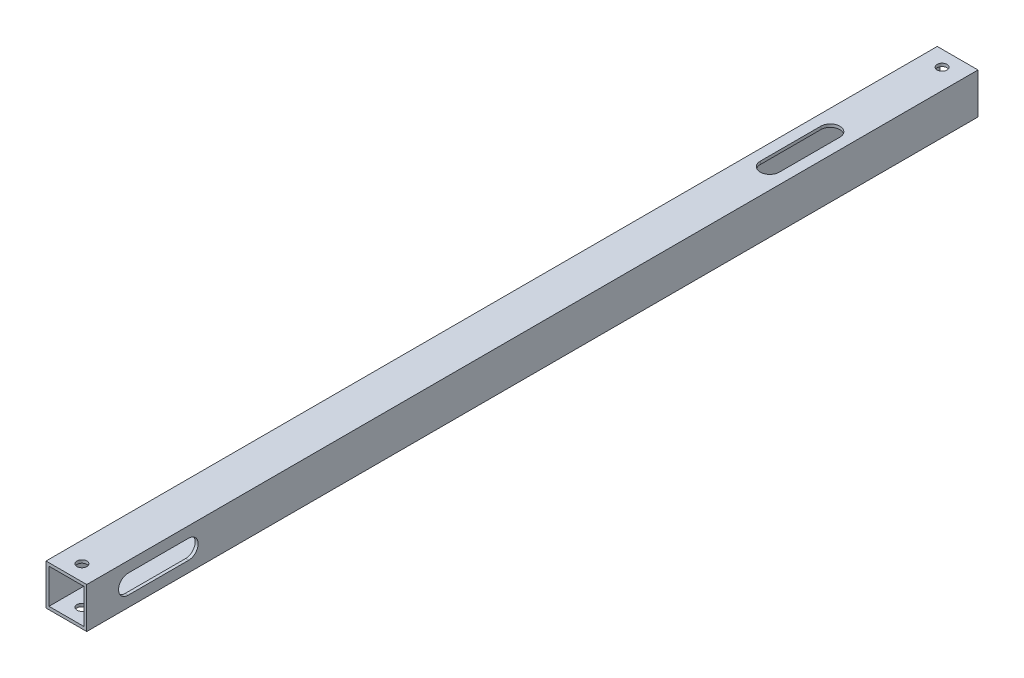
ISO-10303-21;
HEADER;
FILE_DESCRIPTION(('STEP AP214'),'2;1');
FILE_NAME('part.step','',(''),(''),'','','');
FILE_SCHEMA(('AUTOMOTIVE_DESIGN { 1 0 10303 214 1 1 1 1 }'));
ENDSEC;
DATA;
#1=APPLICATION_CONTEXT('core data for automotive mechanical design processes');
#2=APPLICATION_PROTOCOL_DEFINITION('international standard','automotive_design',2000,#1);
#3=PRODUCT_CONTEXT('',#1,'mechanical');
#4=PRODUCT('Part','Part','',(#3));
#5=PRODUCT_RELATED_PRODUCT_CATEGORY('part','',(#4));
#6=PRODUCT_DEFINITION_FORMATION('','',#4);
#7=PRODUCT_DEFINITION_CONTEXT('part definition',#1,'design');
#8=PRODUCT_DEFINITION('design','',#6,#7);
#9=PRODUCT_DEFINITION_SHAPE('','',#8);
#10=(LENGTH_UNIT() NAMED_UNIT(*) SI_UNIT(.MILLI.,.METRE.));
#11=(NAMED_UNIT(*) PLANE_ANGLE_UNIT() SI_UNIT($,.RADIAN.));
#12=(NAMED_UNIT(*) SI_UNIT($,.STERADIAN.) SOLID_ANGLE_UNIT());
#13=UNCERTAINTY_MEASURE_WITH_UNIT(LENGTH_MEASURE(1.E-05),#10,'distance_accuracy_value','');
#14=(GEOMETRIC_REPRESENTATION_CONTEXT(3) GLOBAL_UNCERTAINTY_ASSIGNED_CONTEXT((#13)) GLOBAL_UNIT_ASSIGNED_CONTEXT((#10,
#11,#12)) REPRESENTATION_CONTEXT('',''));
#15=CARTESIAN_POINT('',(0.,0.,0.));
#16=DIRECTION('',(0.,0.,1.));
#17=DIRECTION('',(1.,0.,0.));
#18=AXIS2_PLACEMENT_3D('',#15,#16,#17);
#19=CARTESIAN_POINT('',(-6.4,6.4,-280.));
#20=DIRECTION('',(0.,1.,0.));
#21=DIRECTION('',(-1.,0.,0.));
#22=AXIS2_PLACEMENT_3D('',#19,#20,#21);
#23=PLANE('',#22);
#24=DIRECTION('',(-1.,0.,0.));
#25=VECTOR('',#24,1.);
#26=CARTESIAN_POINT('',(-6.4,6.4,0.));
#27=LINE('',#26,#25);
#28=CARTESIAN_POINT('',(6.4,6.4,0.));
#29=VERTEX_POINT('',#28);
#30=CARTESIAN_POINT('',(-6.4,6.4,0.));
#31=VERTEX_POINT('',#30);
#32=EDGE_CURVE('E339',#29,#31,#27,.T.);
#33=ORIENTED_EDGE('',*,*,#32,.F.);
#34=DIRECTION('',(0.,0.,1.));
#35=VECTOR('',#34,1.);
#36=CARTESIAN_POINT('',(6.4,6.4,-280.));
#37=LINE('',#36,#35);
#38=CARTESIAN_POINT('',(6.4,6.4,-280.));
#39=VERTEX_POINT('',#38);
#40=EDGE_CURVE('E335',#39,#29,#37,.T.);
#41=ORIENTED_EDGE('',*,*,#40,.F.);
#42=DIRECTION('',(-1.,0.,0.));
#43=VECTOR('',#42,1.);
#44=CARTESIAN_POINT('',(-6.4,6.4,-280.));
#45=LINE('',#44,#43);
#46=CARTESIAN_POINT('',(-6.4,6.4,-280.));
#47=VERTEX_POINT('',#46);
#48=EDGE_CURVE('E322',#39,#47,#45,.T.);
#49=ORIENTED_EDGE('',*,*,#48,.T.);
#50=DIRECTION('',(0.,0.,1.));
#51=VECTOR('',#50,1.);
#52=CARTESIAN_POINT('',(-6.4,6.4,-280.));
#53=LINE('',#52,#51);
#54=EDGE_CURVE('E357',#47,#31,#53,.T.);
#55=ORIENTED_EDGE('',*,*,#54,.T.);
#56=EDGE_LOOP('',(#33,#41,#49,#55));
#57=FACE_BOUND('',#56,.T.);
#58=CARTESIAN_POINT('',(0.,6.4,-4.89));
#59=DIRECTION('',(0.,1.,0.));
#60=DIRECTION('',(-1.,0.,0.));
#61=AXIS2_PLACEMENT_3D('',#58,#59,#60);
#62=CIRCLE('',#61,1.55);
#63=CARTESIAN_POINT('',(-1.55,6.4,-4.89));
#64=VERTEX_POINT('',#63);
#65=EDGE_CURVE('E252',#64,#64,#62,.T.);
#66=ORIENTED_EDGE('',*,*,#65,.F.);
#67=EDGE_LOOP('',(#66));
#68=FACE_BOUND('',#67,.T.);
#69=CARTESIAN_POINT('',(0.,6.4,-275.11));
#70=DIRECTION('',(0.,1.,0.));
#71=DIRECTION('',(-1.,0.,0.));
#72=AXIS2_PLACEMENT_3D('',#69,#70,#71);
#73=CIRCLE('',#72,1.55000000000001);
#74=CARTESIAN_POINT('',(-1.55000000000001,6.4,-275.11));
#75=VERTEX_POINT('',#74);
#76=EDGE_CURVE('E265',#75,#75,#73,.F.);
#77=ORIENTED_EDGE('',*,*,#76,.T.);
#78=EDGE_LOOP('',(#77));
#79=FACE_BOUND('',#78,.T.);
#80=DIRECTION('',(0.,0.,-1.));
#81=VECTOR('',#80,1.);
#82=CARTESIAN_POINT('',(-2.99999999999996,6.4,-280.));
#83=LINE('',#82,#81);
#84=CARTESIAN_POINT('',(-2.99999999999997,6.4,-221.));
#85=VERTEX_POINT('',#84);
#86=CARTESIAN_POINT('',(-2.99999999999997,6.4,-240.));
#87=VERTEX_POINT('',#86);
#88=EDGE_CURVE('E239',#85,#87,#83,.T.);
#89=ORIENTED_EDGE('',*,*,#88,.T.);
#90=CARTESIAN_POINT('',(0.,6.4,-240.));
#91=DIRECTION('',(0.,1.,0.));
#92=DIRECTION('',(-1.,0.,0.));
#93=AXIS2_PLACEMENT_3D('',#90,#91,#92);
#94=CIRCLE('',#93,3.);
#95=CARTESIAN_POINT('',(3.00000000000003,6.4,-240.));
#96=VERTEX_POINT('',#95);
#97=EDGE_CURVE('E243',#87,#96,#94,.F.);
#98=ORIENTED_EDGE('',*,*,#97,.T.);
#99=DIRECTION('',(0.,0.,-1.));
#100=VECTOR('',#99,1.);
#101=CARTESIAN_POINT('',(3.00000000000014,6.4,-280.));
#102=LINE('',#101,#100);
#103=CARTESIAN_POINT('',(2.99999999999998,6.4,-221.));
#104=VERTEX_POINT('',#103);
#105=EDGE_CURVE('E232',#104,#96,#102,.T.);
#106=ORIENTED_EDGE('',*,*,#105,.F.);
#107=CARTESIAN_POINT('',(0.,6.4,-221.));
#108=DIRECTION('',(0.,1.,0.));
#109=DIRECTION('',(-1.,0.,0.));
#110=AXIS2_PLACEMENT_3D('',#107,#108,#109);
#111=CIRCLE('',#110,2.99999999999998);
#112=EDGE_CURVE('E235',#104,#85,#111,.F.);
#113=ORIENTED_EDGE('',*,*,#112,.T.);
#114=EDGE_LOOP('',(#89,#98,#106,#113));
#115=FACE_BOUND('',#114,.T.);
#116=ADVANCED_FACE('F69',(#57,#68,#79,#115),#23,.T.);
#117=CARTESIAN_POINT('',(0.,5.46,-280.));
#118=DIRECTION('',(0.,1.,0.));
#119=DIRECTION('',(-1.,0.,0.));
#120=AXIS2_PLACEMENT_3D('',#117,#118,#119);
#121=PLANE('',#120);
#122=CARTESIAN_POINT('',(0.,5.46,-275.11));
#123=DIRECTION('',(0.,1.,0.));
#124=DIRECTION('',(-1.,0.,0.));
#125=AXIS2_PLACEMENT_3D('',#122,#123,#124);
#126=CIRCLE('',#125,1.55000000000001);
#127=CARTESIAN_POINT('',(-1.55000000000001,5.46,-275.11));
#128=VERTEX_POINT('',#127);
#129=EDGE_CURVE('E260',#128,#128,#126,.F.);
#130=ORIENTED_EDGE('',*,*,#129,.F.);
#131=EDGE_LOOP('',(#130));
#132=FACE_BOUND('',#131,.T.);
#133=DIRECTION('',(-1.,0.,0.));
#134=VECTOR('',#133,1.);
#135=CARTESIAN_POINT('',(0.,5.46,0.));
#136=LINE('',#135,#134);
#137=CARTESIAN_POINT('',(5.46,5.46,0.));
#138=VERTEX_POINT('',#137);
#139=CARTESIAN_POINT('',(-5.46,5.46,0.));
#140=VERTEX_POINT('',#139);
#141=EDGE_CURVE('E294',#138,#140,#136,.T.);
#142=ORIENTED_EDGE('',*,*,#141,.T.);
#143=DIRECTION('',(0.,0.,1.));
#144=VECTOR('',#143,1.);
#145=CARTESIAN_POINT('',(-5.46,5.46,-280.));
#146=LINE('',#145,#144);
#147=CARTESIAN_POINT('',(-5.46,5.46,-280.));
#148=VERTEX_POINT('',#147);
#149=EDGE_CURVE('E312',#148,#140,#146,.T.);
#150=ORIENTED_EDGE('',*,*,#149,.F.);
#151=DIRECTION('',(-1.,0.,0.));
#152=VECTOR('',#151,1.);
#153=CARTESIAN_POINT('',(0.,5.46,-280.));
#154=LINE('',#153,#152);
#155=CARTESIAN_POINT('',(5.46,5.46,-280.));
#156=VERTEX_POINT('',#155);
#157=EDGE_CURVE('E278',#156,#148,#154,.T.);
#158=ORIENTED_EDGE('',*,*,#157,.F.);
#159=DIRECTION('',(0.,0.,1.));
#160=VECTOR('',#159,1.);
#161=CARTESIAN_POINT('',(5.46,5.46,-280.));
#162=LINE('',#161,#160);
#163=EDGE_CURVE('E291',#156,#138,#162,.T.);
#164=ORIENTED_EDGE('',*,*,#163,.T.);
#165=EDGE_LOOP('',(#142,#150,#158,#164));
#166=FACE_BOUND('',#165,.T.);
#167=CARTESIAN_POINT('',(0.,5.46,-4.89));
#168=DIRECTION('',(0.,1.,0.));
#169=DIRECTION('',(-1.,0.,0.));
#170=AXIS2_PLACEMENT_3D('',#167,#168,#169);
#171=CIRCLE('',#170,1.55);
#172=CARTESIAN_POINT('',(-1.55,5.46,-4.89));
#173=VERTEX_POINT('',#172);
#174=EDGE_CURVE('E247',#173,#173,#171,.T.);
#175=ORIENTED_EDGE('',*,*,#174,.T.);
#176=EDGE_LOOP('',(#175));
#177=FACE_BOUND('',#176,.T.);
#178=CARTESIAN_POINT('',(0.,5.46,-240.));
#179=DIRECTION('',(0.,1.,0.));
#180=DIRECTION('',(-1.,0.,0.));
#181=AXIS2_PLACEMENT_3D('',#178,#179,#180);
#182=CIRCLE('',#181,3.);
#183=CARTESIAN_POINT('',(-2.99999999999997,5.46,-240.));
#184=VERTEX_POINT('',#183);
#185=CARTESIAN_POINT('',(3.00000000000003,5.46,-240.));
#186=VERTEX_POINT('',#185);
#187=EDGE_CURVE('E377',#184,#186,#182,.F.);
#188=ORIENTED_EDGE('',*,*,#187,.F.);
#189=DIRECTION('',(0.,0.,-1.));
#190=VECTOR('',#189,1.);
#191=CARTESIAN_POINT('',(-2.99999999999996,5.46,-280.));
#192=LINE('',#191,#190);
#193=CARTESIAN_POINT('',(-2.99999999999997,5.46,-221.));
#194=VERTEX_POINT('',#193);
#195=EDGE_CURVE('E374',#194,#184,#192,.T.);
#196=ORIENTED_EDGE('',*,*,#195,.F.);
#197=CARTESIAN_POINT('',(0.,5.46,-221.));
#198=DIRECTION('',(0.,1.,0.));
#199=DIRECTION('',(-1.,0.,0.));
#200=AXIS2_PLACEMENT_3D('',#197,#198,#199);
#201=CIRCLE('',#200,2.99999999999998);
#202=CARTESIAN_POINT('',(2.99999999999998,5.46,-221.));
#203=VERTEX_POINT('',#202);
#204=EDGE_CURVE('E371',#203,#194,#201,.F.);
#205=ORIENTED_EDGE('',*,*,#204,.F.);
#206=DIRECTION('',(0.,0.,-1.));
#207=VECTOR('',#206,1.);
#208=CARTESIAN_POINT('',(3.00000000000014,5.46,-280.));
#209=LINE('',#208,#207);
#210=EDGE_CURVE('E353',#203,#186,#209,.T.);
#211=ORIENTED_EDGE('',*,*,#210,.T.);
#212=EDGE_LOOP('',(#188,#196,#205,#211));
#213=FACE_BOUND('',#212,.T.);
#214=ADVANCED_FACE('F408',(#132,#166,#177,#213),#121,.F.);
#215=CARTESIAN_POINT('',(-6.4,-6.4,-280.));
#216=DIRECTION('',(0.,-1.,0.));
#217=DIRECTION('',(0.,0.,-1.));
#218=AXIS2_PLACEMENT_3D('',#215,#216,#217);
#219=PLANE('',#218);
#220=DIRECTION('',(1.,0.,0.));
#221=VECTOR('',#220,1.);
#222=CARTESIAN_POINT('',(-6.4,-6.4,0.));
#223=LINE('',#222,#221);
#224=CARTESIAN_POINT('',(-6.4,-6.4,0.));
#225=VERTEX_POINT('',#224);
#226=CARTESIAN_POINT('',(6.4,-6.4,0.));
#227=VERTEX_POINT('',#226);
#228=EDGE_CURVE('E323',#225,#227,#223,.T.);
#229=ORIENTED_EDGE('',*,*,#228,.F.);
#230=DIRECTION('',(0.,0.,1.));
#231=VECTOR('',#230,1.);
#232=CARTESIAN_POINT('',(-6.4,-6.4,-280.));
#233=LINE('',#232,#231);
#234=CARTESIAN_POINT('',(-6.4,-6.4,-280.));
#235=VERTEX_POINT('',#234);
#236=EDGE_CURVE('E354',#235,#225,#233,.T.);
#237=ORIENTED_EDGE('',*,*,#236,.F.);
#238=DIRECTION('',(1.,0.,0.));
#239=VECTOR('',#238,1.);
#240=CARTESIAN_POINT('',(-6.4,-6.4,-280.));
#241=LINE('',#240,#239);
#242=CARTESIAN_POINT('',(6.4,-6.4,-280.));
#243=VERTEX_POINT('',#242);
#244=EDGE_CURVE('E331',#235,#243,#241,.T.);
#245=ORIENTED_EDGE('',*,*,#244,.T.);
#246=DIRECTION('',(0.,0.,1.));
#247=VECTOR('',#246,1.);
#248=CARTESIAN_POINT('',(6.4,-6.4,-280.));
#249=LINE('',#248,#247);
#250=EDGE_CURVE('E350',#243,#227,#249,.T.);
#251=ORIENTED_EDGE('',*,*,#250,.T.);
#252=EDGE_LOOP('',(#229,#237,#245,#251));
#253=FACE_BOUND('',#252,.T.);
#254=CARTESIAN_POINT('',(0.,-6.4,-4.89));
#255=DIRECTION('',(0.,-1.,0.));
#256=DIRECTION('',(0.,0.,-1.));
#257=AXIS2_PLACEMENT_3D('',#254,#255,#256);
#258=CIRCLE('',#257,1.55);
#259=CARTESIAN_POINT('',(0.,-6.4,-6.44));
#260=VERTEX_POINT('',#259);
#261=EDGE_CURVE('E256',#260,#260,#258,.T.);
#262=ORIENTED_EDGE('',*,*,#261,.F.);
#263=EDGE_LOOP('',(#262));
#264=FACE_BOUND('',#263,.T.);
#265=CARTESIAN_POINT('',(0.,-6.4,-275.11));
#266=DIRECTION('',(0.,-1.,0.));
#267=DIRECTION('',(0.,0.,-1.));
#268=AXIS2_PLACEMENT_3D('',#265,#266,#267);
#269=CIRCLE('',#268,1.55000000000001);
#270=CARTESIAN_POINT('',(0.,-6.4,-276.66));
#271=VERTEX_POINT('',#270);
#272=EDGE_CURVE('E269',#271,#271,#269,.F.);
#273=ORIENTED_EDGE('',*,*,#272,.T.);
#274=EDGE_LOOP('',(#273));
#275=FACE_BOUND('',#274,.T.);
#276=ADVANCED_FACE('F414',(#253,#264,#275),#219,.T.);
#277=CARTESIAN_POINT('',(0.,-5.46,-280.));
#278=DIRECTION('',(0.,-1.,0.));
#279=DIRECTION('',(0.,0.,-1.));
#280=AXIS2_PLACEMENT_3D('',#277,#278,#279);
#281=PLANE('',#280);
#282=CARTESIAN_POINT('',(0.,-5.46,-4.89));
#283=DIRECTION('',(0.,-1.,0.));
#284=DIRECTION('',(0.,0.,-1.));
#285=AXIS2_PLACEMENT_3D('',#282,#283,#284);
#286=CIRCLE('',#285,1.55);
#287=CARTESIAN_POINT('',(0.,-5.46,-6.44));
#288=VERTEX_POINT('',#287);
#289=EDGE_CURVE('E248',#288,#288,#286,.T.);
#290=ORIENTED_EDGE('',*,*,#289,.T.);
#291=EDGE_LOOP('',(#290));
#292=FACE_BOUND('',#291,.T.);
#293=DIRECTION('',(1.,0.,0.));
#294=VECTOR('',#293,1.);
#295=CARTESIAN_POINT('',(0.,-5.46,0.));
#296=LINE('',#295,#294);
#297=CARTESIAN_POINT('',(-5.46,-5.46,0.));
#298=VERTEX_POINT('',#297);
#299=CARTESIAN_POINT('',(5.46,-5.46,0.));
#300=VERTEX_POINT('',#299);
#301=EDGE_CURVE('E279',#298,#300,#296,.T.);
#302=ORIENTED_EDGE('',*,*,#301,.T.);
#303=DIRECTION('',(0.,0.,1.));
#304=VECTOR('',#303,1.);
#305=CARTESIAN_POINT('',(5.46,-5.46,-280.));
#306=LINE('',#305,#304);
#307=CARTESIAN_POINT('',(5.46,-5.46,-280.));
#308=VERTEX_POINT('',#307);
#309=EDGE_CURVE('E305',#308,#300,#306,.T.);
#310=ORIENTED_EDGE('',*,*,#309,.F.);
#311=DIRECTION('',(1.,0.,0.));
#312=VECTOR('',#311,1.);
#313=CARTESIAN_POINT('',(0.,-5.46,-280.));
#314=LINE('',#313,#312);
#315=CARTESIAN_POINT('',(-5.46,-5.46,-280.));
#316=VERTEX_POINT('',#315);
#317=EDGE_CURVE('E287',#316,#308,#314,.T.);
#318=ORIENTED_EDGE('',*,*,#317,.F.);
#319=DIRECTION('',(0.,0.,1.));
#320=VECTOR('',#319,1.);
#321=CARTESIAN_POINT('',(-5.46,-5.46,-280.));
#322=LINE('',#321,#320);
#323=EDGE_CURVE('E309',#316,#298,#322,.T.);
#324=ORIENTED_EDGE('',*,*,#323,.T.);
#325=EDGE_LOOP('',(#302,#310,#318,#324));
#326=FACE_BOUND('',#325,.T.);
#327=CARTESIAN_POINT('',(0.,-5.46,-275.11));
#328=DIRECTION('',(0.,-1.,0.));
#329=DIRECTION('',(0.,0.,-1.));
#330=AXIS2_PLACEMENT_3D('',#327,#328,#329);
#331=CIRCLE('',#330,1.55000000000001);
#332=CARTESIAN_POINT('',(0.,-5.46,-276.66));
#333=VERTEX_POINT('',#332);
#334=EDGE_CURVE('E261',#333,#333,#331,.F.);
#335=ORIENTED_EDGE('',*,*,#334,.F.);
#336=EDGE_LOOP('',(#335));
#337=FACE_BOUND('',#336,.T.);
#338=ADVANCED_FACE('F427',(#292,#326,#337),#281,.F.);
#339=CARTESIAN_POINT('',(6.4,-6.4,-280.));
#340=DIRECTION('',(1.,0.,0.));
#341=DIRECTION('',(0.,1.,0.));
#342=AXIS2_PLACEMENT_3D('',#339,#340,#341);
#343=PLANE('',#342);
#344=CARTESIAN_POINT('',(6.4,0.,-13.));
#345=DIRECTION('',(1.,0.,0.));
#346=DIRECTION('',(0.,1.,0.));
#347=AXIS2_PLACEMENT_3D('',#344,#345,#346);
#348=CIRCLE('',#347,3.);
#349=CARTESIAN_POINT('',(6.4,3.,-13.));
#350=VERTEX_POINT('',#349);
#351=CARTESIAN_POINT('',(6.4,-3.,-13.));
#352=VERTEX_POINT('',#351);
#353=EDGE_CURVE('E85',#350,#352,#348,.T.);
#354=ORIENTED_EDGE('',*,*,#353,.F.);
#355=DIRECTION('',(0.,0.,1.));
#356=VECTOR('',#355,1.);
#357=CARTESIAN_POINT('',(6.4,3.,-13.));
#358=LINE('',#357,#356);
#359=CARTESIAN_POINT('',(6.4,3.,-32.));
#360=VERTEX_POINT('',#359);
#361=EDGE_CURVE('E203',#360,#350,#358,.T.);
#362=ORIENTED_EDGE('',*,*,#361,.F.);
#363=CARTESIAN_POINT('',(6.4,0.,-32.));
#364=DIRECTION('',(1.,0.,0.));
#365=DIRECTION('',(0.,1.,0.));
#366=AXIS2_PLACEMENT_3D('',#363,#364,#365);
#367=CIRCLE('',#366,3.);
#368=CARTESIAN_POINT('',(6.4,-3.,-32.));
#369=VERTEX_POINT('',#368);
#370=EDGE_CURVE('E186',#369,#360,#367,.T.);
#371=ORIENTED_EDGE('',*,*,#370,.F.);
#372=DIRECTION('',(0.,0.,-1.));
#373=VECTOR('',#372,1.);
#374=CARTESIAN_POINT('',(6.4,-3.,-13.));
#375=LINE('',#374,#373);
#376=EDGE_CURVE('E196',#352,#369,#375,.T.);
#377=ORIENTED_EDGE('',*,*,#376,.F.);
#378=EDGE_LOOP('',(#354,#362,#371,#377));
#379=FACE_BOUND('',#378,.T.);
#380=DIRECTION('',(0.,1.,0.));
#381=VECTOR('',#380,1.);
#382=CARTESIAN_POINT('',(6.4,-6.4,0.));
#383=LINE('',#382,#381);
#384=EDGE_CURVE('E308',#227,#29,#383,.T.);
#385=ORIENTED_EDGE('',*,*,#384,.F.);
#386=ORIENTED_EDGE('',*,*,#250,.F.);
#387=DIRECTION('',(0.,1.,0.));
#388=VECTOR('',#387,1.);
#389=CARTESIAN_POINT('',(6.4,-6.4,-280.));
#390=LINE('',#389,#388);
#391=EDGE_CURVE('E318',#243,#39,#390,.T.);
#392=ORIENTED_EDGE('',*,*,#391,.T.);
#393=ORIENTED_EDGE('',*,*,#40,.T.);
#394=EDGE_LOOP('',(#385,#386,#392,#393));
#395=FACE_BOUND('',#394,.T.);
#396=ADVANCED_FACE('F71',(#379,#395),#343,.T.);
#397=CARTESIAN_POINT('',(-6.4,-6.4,-280.));
#398=DIRECTION('',(-1.,0.,0.));
#399=DIRECTION('',(0.,0.,1.));
#400=AXIS2_PLACEMENT_3D('',#397,#398,#399);
#401=PLANE('',#400);
#402=DIRECTION('',(0.,-1.,0.));
#403=VECTOR('',#402,1.);
#404=CARTESIAN_POINT('',(-6.4,-6.4,0.));
#405=LINE('',#404,#403);
#406=EDGE_CURVE('E343',#31,#225,#405,.T.);
#407=ORIENTED_EDGE('',*,*,#406,.F.);
#408=ORIENTED_EDGE('',*,*,#54,.F.);
#409=DIRECTION('',(0.,-1.,0.));
#410=VECTOR('',#409,1.);
#411=CARTESIAN_POINT('',(-6.4,-6.4,-280.));
#412=LINE('',#411,#410);
#413=EDGE_CURVE('E327',#47,#235,#412,.T.);
#414=ORIENTED_EDGE('',*,*,#413,.T.);
#415=ORIENTED_EDGE('',*,*,#236,.T.);
#416=EDGE_LOOP('',(#407,#408,#414,#415));
#417=FACE_BOUND('',#416,.T.);
#418=ADVANCED_FACE('F420',(#417),#401,.T.);
#419=CARTESIAN_POINT('',(0.,0.,-280.));
#420=DIRECTION('',(0.,0.,1.));
#421=DIRECTION('',(1.,0.,0.));
#422=AXIS2_PLACEMENT_3D('',#419,#420,#421);
#423=PLANE('',#422);
#424=ORIENTED_EDGE('',*,*,#317,.T.);
#425=DIRECTION('',(0.,1.,0.));
#426=VECTOR('',#425,1.);
#427=CARTESIAN_POINT('',(5.46,0.,-280.));
#428=LINE('',#427,#426);
#429=EDGE_CURVE('E274',#308,#156,#428,.T.);
#430=ORIENTED_EDGE('',*,*,#429,.T.);
#431=ORIENTED_EDGE('',*,*,#157,.T.);
#432=DIRECTION('',(0.,-1.,0.));
#433=VECTOR('',#432,1.);
#434=CARTESIAN_POINT('',(-5.46,0.,-280.));
#435=LINE('',#434,#433);
#436=EDGE_CURVE('E283',#148,#316,#435,.T.);
#437=ORIENTED_EDGE('',*,*,#436,.T.);
#438=EDGE_LOOP('',(#424,#430,#431,#437));
#439=FACE_BOUND('',#438,.T.);
#440=ORIENTED_EDGE('',*,*,#391,.F.);
#441=ORIENTED_EDGE('',*,*,#244,.F.);
#442=ORIENTED_EDGE('',*,*,#413,.F.);
#443=ORIENTED_EDGE('',*,*,#48,.F.);
#444=EDGE_LOOP('',(#440,#441,#442,#443));
#445=FACE_BOUND('',#444,.T.);
#446=ADVANCED_FACE('F423',(#439,#445),#423,.F.);
#447=CARTESIAN_POINT('',(0.,0.,0.));
#448=DIRECTION('',(0.,0.,1.));
#449=DIRECTION('',(1.,0.,0.));
#450=AXIS2_PLACEMENT_3D('',#447,#448,#449);
#451=PLANE('',#450);
#452=DIRECTION('',(0.,1.,0.));
#453=VECTOR('',#452,1.);
#454=CARTESIAN_POINT('',(5.46,0.,0.));
#455=LINE('',#454,#453);
#456=EDGE_CURVE('E273',#300,#138,#455,.T.);
#457=ORIENTED_EDGE('',*,*,#456,.F.);
#458=ORIENTED_EDGE('',*,*,#301,.F.);
#459=DIRECTION('',(0.,-1.,0.));
#460=VECTOR('',#459,1.);
#461=CARTESIAN_POINT('',(-5.46,0.,0.));
#462=LINE('',#461,#460);
#463=EDGE_CURVE('E298',#140,#298,#462,.T.);
#464=ORIENTED_EDGE('',*,*,#463,.F.);
#465=ORIENTED_EDGE('',*,*,#141,.F.);
#466=EDGE_LOOP('',(#457,#458,#464,#465));
#467=FACE_BOUND('',#466,.T.);
#468=ORIENTED_EDGE('',*,*,#384,.T.);
#469=ORIENTED_EDGE('',*,*,#32,.T.);
#470=ORIENTED_EDGE('',*,*,#406,.T.);
#471=ORIENTED_EDGE('',*,*,#228,.T.);
#472=EDGE_LOOP('',(#468,#469,#470,#471));
#473=FACE_BOUND('',#472,.T.);
#474=ADVANCED_FACE('F429',(#467,#473),#451,.T.);
#475=CARTESIAN_POINT('',(5.46,0.,-280.));
#476=DIRECTION('',(1.,0.,0.));
#477=DIRECTION('',(0.,1.,0.));
#478=AXIS2_PLACEMENT_3D('',#475,#476,#477);
#479=PLANE('',#478);
#480=DIRECTION('',(0.,0.,1.));
#481=VECTOR('',#480,1.);
#482=CARTESIAN_POINT('',(5.46,3.,-280.));
#483=LINE('',#482,#481);
#484=CARTESIAN_POINT('',(5.46,3.,-32.));
#485=VERTEX_POINT('',#484);
#486=CARTESIAN_POINT('',(5.46,3.,-13.));
#487=VERTEX_POINT('',#486);
#488=EDGE_CURVE('E78',#485,#487,#483,.T.);
#489=ORIENTED_EDGE('',*,*,#488,.T.);
#490=CARTESIAN_POINT('',(5.46,0.,-13.));
#491=DIRECTION('',(1.,0.,0.));
#492=DIRECTION('',(0.,1.,0.));
#493=AXIS2_PLACEMENT_3D('',#490,#491,#492);
#494=CIRCLE('',#493,3.);
#495=CARTESIAN_POINT('',(5.46,-3.,-13.));
#496=VERTEX_POINT('',#495);
#497=EDGE_CURVE('E12',#487,#496,#494,.T.);
#498=ORIENTED_EDGE('',*,*,#497,.T.);
#499=DIRECTION('',(0.,0.,-1.));
#500=VECTOR('',#499,1.);
#501=CARTESIAN_POINT('',(5.46,-3.,-280.));
#502=LINE('',#501,#500);
#503=CARTESIAN_POINT('',(5.46,-3.,-32.));
#504=VERTEX_POINT('',#503);
#505=EDGE_CURVE('E381',#496,#504,#502,.T.);
#506=ORIENTED_EDGE('',*,*,#505,.T.);
#507=CARTESIAN_POINT('',(5.46,0.,-32.));
#508=DIRECTION('',(1.,0.,0.));
#509=DIRECTION('',(0.,1.,0.));
#510=AXIS2_PLACEMENT_3D('',#507,#508,#509);
#511=CIRCLE('',#510,3.);
#512=EDGE_CURVE('E189',#504,#485,#511,.T.);
#513=ORIENTED_EDGE('',*,*,#512,.T.);
#514=EDGE_LOOP('',(#489,#498,#506,#513));
#515=FACE_BOUND('',#514,.T.);
#516=ORIENTED_EDGE('',*,*,#456,.T.);
#517=ORIENTED_EDGE('',*,*,#163,.F.);
#518=ORIENTED_EDGE('',*,*,#429,.F.);
#519=ORIENTED_EDGE('',*,*,#309,.T.);
#520=EDGE_LOOP('',(#516,#517,#518,#519));
#521=FACE_BOUND('',#520,.T.);
#522=ADVANCED_FACE('F388',(#515,#521),#479,.F.);
#523=CARTESIAN_POINT('',(-5.46,0.,-280.));
#524=DIRECTION('',(-1.,0.,0.));
#525=DIRECTION('',(0.,0.,1.));
#526=AXIS2_PLACEMENT_3D('',#523,#524,#525);
#527=PLANE('',#526);
#528=ORIENTED_EDGE('',*,*,#463,.T.);
#529=ORIENTED_EDGE('',*,*,#323,.F.);
#530=ORIENTED_EDGE('',*,*,#436,.F.);
#531=ORIENTED_EDGE('',*,*,#149,.T.);
#532=EDGE_LOOP('',(#528,#529,#530,#531));
#533=FACE_BOUND('',#532,.T.);
#534=ADVANCED_FACE('F436',(#533),#527,.F.);
#535=CARTESIAN_POINT('',(0.,-10.,-4.89));
#536=DIRECTION('',(0.,1.,0.));
#537=DIRECTION('',(0.,0.,1.));
#538=AXIS2_PLACEMENT_3D('',#535,#536,#537);
#539=CYLINDRICAL_SURFACE('',#538,1.55);
#540=ORIENTED_EDGE('',*,*,#65,.T.);
#541=EDGE_LOOP('',(#540));
#542=FACE_BOUND('',#541,.T.);
#543=ORIENTED_EDGE('',*,*,#174,.F.);
#544=EDGE_LOOP('',(#543));
#545=FACE_BOUND('',#544,.T.);
#546=ADVANCED_FACE('F440',(#542,#545),#539,.F.);
#547=CARTESIAN_POINT('',(0.,-10.,-275.11));
#548=DIRECTION('',(0.,1.,0.));
#549=DIRECTION('',(0.,0.,1.));
#550=AXIS2_PLACEMENT_3D('',#547,#548,#549);
#551=CYLINDRICAL_SURFACE('',#550,1.55000000000001);
#552=ORIENTED_EDGE('',*,*,#76,.F.);
#553=EDGE_LOOP('',(#552));
#554=FACE_BOUND('',#553,.T.);
#555=ORIENTED_EDGE('',*,*,#129,.T.);
#556=EDGE_LOOP('',(#555));
#557=FACE_BOUND('',#556,.T.);
#558=ADVANCED_FACE('F449',(#554,#557),#551,.F.);
#559=ORIENTED_EDGE('',*,*,#261,.T.);
#560=EDGE_LOOP('',(#559));
#561=FACE_BOUND('',#560,.T.);
#562=ORIENTED_EDGE('',*,*,#289,.F.);
#563=EDGE_LOOP('',(#562));
#564=FACE_BOUND('',#563,.T.);
#565=ADVANCED_FACE('F445',(#561,#564),#539,.F.);
#566=ORIENTED_EDGE('',*,*,#272,.F.);
#567=EDGE_LOOP('',(#566));
#568=FACE_BOUND('',#567,.T.);
#569=ORIENTED_EDGE('',*,*,#334,.T.);
#570=EDGE_LOOP('',(#569));
#571=FACE_BOUND('',#570,.T.);
#572=ADVANCED_FACE('F448',(#568,#571),#551,.F.);
#573=CARTESIAN_POINT('',(0.,10.,-240.));
#574=DIRECTION('',(0.,-1.,0.));
#575=DIRECTION('',(0.,0.,-1.));
#576=AXIS2_PLACEMENT_3D('',#573,#574,#575);
#577=CYLINDRICAL_SURFACE('',#576,3.);
#578=DIRECTION('',(0.,-1.,0.));
#579=VECTOR('',#578,1.);
#580=CARTESIAN_POINT('',(-2.99999999999997,10.,-240.));
#581=LINE('',#580,#579);
#582=EDGE_CURVE('E228',#87,#184,#581,.T.);
#583=ORIENTED_EDGE('',*,*,#582,.T.);
#584=ORIENTED_EDGE('',*,*,#187,.T.);
#585=DIRECTION('',(0.,-1.,0.));
#586=VECTOR('',#585,1.);
#587=CARTESIAN_POINT('',(3.00000000000003,10.,-240.));
#588=LINE('',#587,#586);
#589=EDGE_CURVE('E213',#96,#186,#588,.T.);
#590=ORIENTED_EDGE('',*,*,#589,.F.);
#591=ORIENTED_EDGE('',*,*,#97,.F.);
#592=EDGE_LOOP('',(#583,#584,#590,#591));
#593=FACE_BOUND('',#592,.T.);
#594=ADVANCED_FACE('F452',(#593),#577,.F.);
#595=CARTESIAN_POINT('',(-2.99999999999997,10.,-240.));
#596=DIRECTION('',(1.,0.,0.));
#597=DIRECTION('',(0.,0.,-1.));
#598=AXIS2_PLACEMENT_3D('',#595,#596,#597);
#599=PLANE('',#598);
#600=DIRECTION('',(0.,-1.,0.));
#601=VECTOR('',#600,1.);
#602=CARTESIAN_POINT('',(-2.99999999999997,10.,-221.));
#603=LINE('',#602,#601);
#604=EDGE_CURVE('E224',#85,#194,#603,.T.);
#605=ORIENTED_EDGE('',*,*,#604,.T.);
#606=ORIENTED_EDGE('',*,*,#195,.T.);
#607=ORIENTED_EDGE('',*,*,#582,.F.);
#608=ORIENTED_EDGE('',*,*,#88,.F.);
#609=EDGE_LOOP('',(#605,#606,#607,#608));
#610=FACE_BOUND('',#609,.T.);
#611=ADVANCED_FACE('F456',(#610),#599,.T.);
#612=CARTESIAN_POINT('',(0.,10.,-221.));
#613=DIRECTION('',(0.,-1.,0.));
#614=DIRECTION('',(0.,0.,-1.));
#615=AXIS2_PLACEMENT_3D('',#612,#613,#614);
#616=CYLINDRICAL_SURFACE('',#615,2.99999999999998);
#617=DIRECTION('',(0.,-1.,0.));
#618=VECTOR('',#617,1.);
#619=CARTESIAN_POINT('',(2.99999999999998,10.,-221.));
#620=LINE('',#619,#618);
#621=EDGE_CURVE('E220',#104,#203,#620,.T.);
#622=ORIENTED_EDGE('',*,*,#621,.T.);
#623=ORIENTED_EDGE('',*,*,#204,.T.);
#624=ORIENTED_EDGE('',*,*,#604,.F.);
#625=ORIENTED_EDGE('',*,*,#112,.F.);
#626=EDGE_LOOP('',(#622,#623,#624,#625));
#627=FACE_BOUND('',#626,.T.);
#628=ADVANCED_FACE('F403',(#627),#616,.F.);
#629=CARTESIAN_POINT('',(3.00000000000003,10.,-240.));
#630=DIRECTION('',(1.,0.,0.));
#631=DIRECTION('',(0.,0.,-1.));
#632=AXIS2_PLACEMENT_3D('',#629,#630,#631);
#633=PLANE('',#632);
#634=ORIENTED_EDGE('',*,*,#105,.T.);
#635=ORIENTED_EDGE('',*,*,#589,.T.);
#636=ORIENTED_EDGE('',*,*,#210,.F.);
#637=ORIENTED_EDGE('',*,*,#621,.F.);
#638=EDGE_LOOP('',(#634,#635,#636,#637));
#639=FACE_BOUND('',#638,.T.);
#640=ADVANCED_FACE('F395',(#639),#633,.F.);
#641=CARTESIAN_POINT('',(-3.6,0.,-13.));
#642=DIRECTION('',(1.,0.,0.));
#643=DIRECTION('',(0.,1.,0.));
#644=AXIS2_PLACEMENT_3D('',#641,#642,#643);
#645=CYLINDRICAL_SURFACE('',#644,3.);
#646=DIRECTION('',(1.,0.,0.));
#647=VECTOR('',#646,1.);
#648=CARTESIAN_POINT('',(-3.6,3.,-13.));
#649=LINE('',#648,#647);
#650=EDGE_CURVE('E210',#487,#350,#649,.T.);
#651=ORIENTED_EDGE('',*,*,#650,.T.);
#652=ORIENTED_EDGE('',*,*,#353,.T.);
#653=DIRECTION('',(1.,0.,0.));
#654=VECTOR('',#653,1.);
#655=CARTESIAN_POINT('',(-3.6,-3.,-13.));
#656=LINE('',#655,#654);
#657=EDGE_CURVE('E193',#496,#352,#656,.T.);
#658=ORIENTED_EDGE('',*,*,#657,.F.);
#659=ORIENTED_EDGE('',*,*,#497,.F.);
#660=EDGE_LOOP('',(#651,#652,#658,#659));
#661=FACE_BOUND('',#660,.T.);
#662=ADVANCED_FACE('F393',(#661),#645,.F.);
#663=CARTESIAN_POINT('',(-3.6,3.,-13.));
#664=DIRECTION('',(0.,1.,0.));
#665=DIRECTION('',(-1.,0.,0.));
#666=AXIS2_PLACEMENT_3D('',#663,#664,#665);
#667=PLANE('',#666);
#668=DIRECTION('',(1.,0.,0.));
#669=VECTOR('',#668,1.);
#670=CARTESIAN_POINT('',(-3.6,3.,-32.));
#671=LINE('',#670,#669);
#672=EDGE_CURVE('E192',#485,#360,#671,.T.);
#673=ORIENTED_EDGE('',*,*,#672,.T.);
#674=ORIENTED_EDGE('',*,*,#361,.T.);
#675=ORIENTED_EDGE('',*,*,#650,.F.);
#676=ORIENTED_EDGE('',*,*,#488,.F.);
#677=EDGE_LOOP('',(#673,#674,#675,#676));
#678=FACE_BOUND('',#677,.T.);
#679=ADVANCED_FACE('F392',(#678),#667,.F.);
#680=CARTESIAN_POINT('',(-3.6,0.,-32.));
#681=DIRECTION('',(1.,0.,0.));
#682=DIRECTION('',(0.,1.,0.));
#683=AXIS2_PLACEMENT_3D('',#680,#681,#682);
#684=CYLINDRICAL_SURFACE('',#683,3.);
#685=DIRECTION('',(1.,0.,0.));
#686=VECTOR('',#685,1.);
#687=CARTESIAN_POINT('',(-3.6,-3.,-32.));
#688=LINE('',#687,#686);
#689=EDGE_CURVE('E93',#504,#369,#688,.T.);
#690=ORIENTED_EDGE('',*,*,#689,.T.);
#691=ORIENTED_EDGE('',*,*,#370,.T.);
#692=ORIENTED_EDGE('',*,*,#672,.F.);
#693=ORIENTED_EDGE('',*,*,#512,.F.);
#694=EDGE_LOOP('',(#690,#691,#692,#693));
#695=FACE_BOUND('',#694,.T.);
#696=ADVANCED_FACE('F183',(#695),#684,.F.);
#697=CARTESIAN_POINT('',(-3.6,-3.,-13.));
#698=DIRECTION('',(0.,-1.,0.));
#699=DIRECTION('',(1.,0.,0.));
#700=AXIS2_PLACEMENT_3D('',#697,#698,#699);
#701=PLANE('',#700);
#702=ORIENTED_EDGE('',*,*,#657,.T.);
#703=ORIENTED_EDGE('',*,*,#376,.T.);
#704=ORIENTED_EDGE('',*,*,#689,.F.);
#705=ORIENTED_EDGE('',*,*,#505,.F.);
#706=EDGE_LOOP('',(#702,#703,#704,#705));
#707=FACE_BOUND('',#706,.T.);
#708=ADVANCED_FACE('F197',(#707),#701,.F.);
#709=CLOSED_SHELL('',(#116,#214,#276,#338,#396,#418,#446,#474,#522,#534,#546,#558,#565,#572,
#594,#611,#628,#640,#662,#679,#696,#708));
#710=MANIFOLD_SOLID_BREP('B2',#709);
#711=ADVANCED_BREP_SHAPE_REPRESENTATION('',(#18,#710),#14);
#712=SHAPE_DEFINITION_REPRESENTATION(#9,#711);
ENDSEC;
END-ISO-10303-21;
